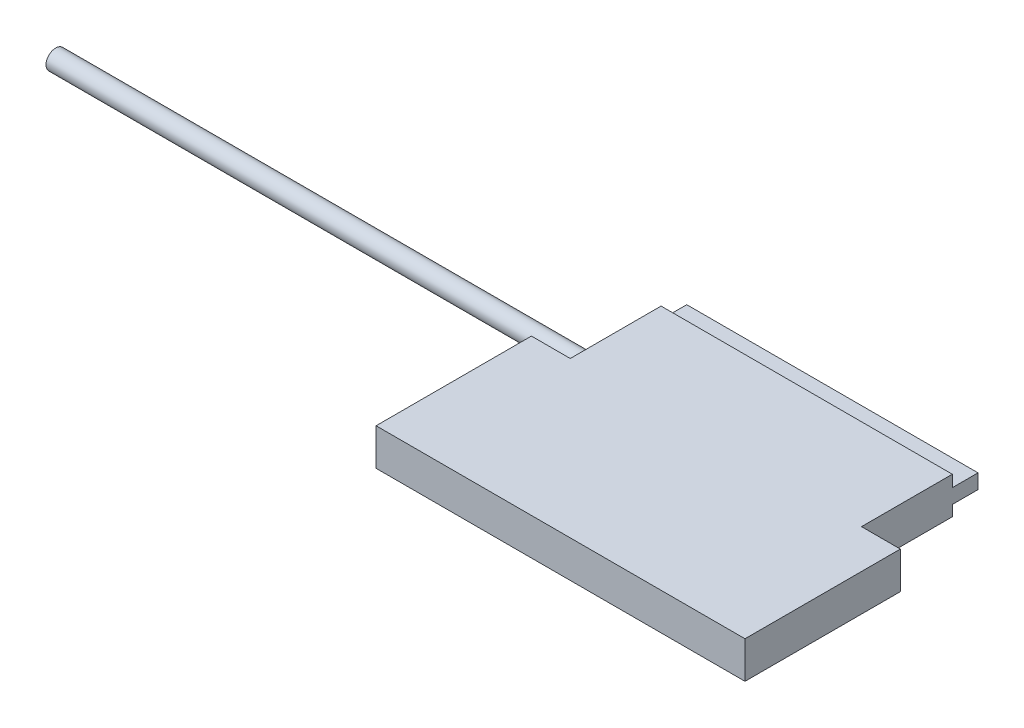
ISO-10303-21;
HEADER;
FILE_DESCRIPTION(('STEP AP214'),'2;1');
FILE_NAME('part.step','',(''),(''),'','','');
FILE_SCHEMA(('AUTOMOTIVE_DESIGN { 1 0 10303 214 1 1 1 1 }'));
ENDSEC;
DATA;
#1=APPLICATION_CONTEXT('core data for automotive mechanical design processes');
#2=APPLICATION_PROTOCOL_DEFINITION('international standard','automotive_design',2000,#1);
#3=PRODUCT_CONTEXT('',#1,'mechanical');
#4=PRODUCT('Part','Part','',(#3));
#5=PRODUCT_RELATED_PRODUCT_CATEGORY('part','',(#4));
#6=PRODUCT_DEFINITION_FORMATION('','',#4);
#7=PRODUCT_DEFINITION_CONTEXT('part definition',#1,'design');
#8=PRODUCT_DEFINITION('design','',#6,#7);
#9=PRODUCT_DEFINITION_SHAPE('','',#8);
#10=(LENGTH_UNIT() NAMED_UNIT(*) SI_UNIT(.MILLI.,.METRE.));
#11=(NAMED_UNIT(*) PLANE_ANGLE_UNIT() SI_UNIT($,.RADIAN.));
#12=(NAMED_UNIT(*) SI_UNIT($,.STERADIAN.) SOLID_ANGLE_UNIT());
#13=UNCERTAINTY_MEASURE_WITH_UNIT(LENGTH_MEASURE(1.E-05),#10,'distance_accuracy_value','');
#14=(GEOMETRIC_REPRESENTATION_CONTEXT(3) GLOBAL_UNCERTAINTY_ASSIGNED_CONTEXT((#13)) GLOBAL_UNIT_ASSIGNED_CONTEXT((#10,
#11,#12)) REPRESENTATION_CONTEXT('',''));
#15=CARTESIAN_POINT('',(0.,0.,0.));
#16=DIRECTION('',(0.,0.,1.));
#17=DIRECTION('',(1.,0.,0.));
#18=AXIS2_PLACEMENT_3D('',#15,#16,#17);
#19=CARTESIAN_POINT('',(0.,1.9,-8.));
#20=DIRECTION('',(1.,0.,0.));
#21=DIRECTION('',(0.,0.,-1.));
#22=AXIS2_PLACEMENT_3D('',#19,#20,#21);
#23=PLANE('',#22);
#24=DIRECTION('',(0.,0.,1.));
#25=VECTOR('',#24,1.);
#26=CARTESIAN_POINT('',(0.,0.,-8.));
#27=LINE('',#26,#25);
#28=CARTESIAN_POINT('',(0.,0.,-8.));
#29=VERTEX_POINT('',#28);
#30=CARTESIAN_POINT('',(0.,0.,0.));
#31=VERTEX_POINT('',#30);
#32=EDGE_CURVE('E163',#29,#31,#27,.T.);
#33=ORIENTED_EDGE('',*,*,#32,.T.);
#34=DIRECTION('',(0.,-1.,0.));
#35=VECTOR('',#34,1.);
#36=CARTESIAN_POINT('',(0.,1.9,0.));
#37=LINE('',#36,#35);
#38=CARTESIAN_POINT('',(0.,1.9,0.));
#39=VERTEX_POINT('',#38);
#40=EDGE_CURVE('E216',#39,#31,#37,.T.);
#41=ORIENTED_EDGE('',*,*,#40,.F.);
#42=DIRECTION('',(0.,0.,1.));
#43=VECTOR('',#42,1.);
#44=CARTESIAN_POINT('',(0.,1.9,-8.));
#45=LINE('',#44,#43);
#46=CARTESIAN_POINT('',(0.,1.9,-8.));
#47=VERTEX_POINT('',#46);
#48=EDGE_CURVE('E166',#47,#39,#45,.T.);
#49=ORIENTED_EDGE('',*,*,#48,.F.);
#50=DIRECTION('',(0.,-1.,0.));
#51=VECTOR('',#50,1.);
#52=CARTESIAN_POINT('',(0.,1.9,-8.));
#53=LINE('',#52,#51);
#54=EDGE_CURVE('E182',#47,#29,#53,.T.);
#55=ORIENTED_EDGE('',*,*,#54,.T.);
#56=EDGE_LOOP('',(#33,#41,#49,#55));
#57=FACE_BOUND('',#56,.T.);
#58=ADVANCED_FACE('F33',(#57),#23,.F.);
#59=CARTESIAN_POINT('',(0.,1.9,0.));
#60=DIRECTION('',(0.,0.,-1.));
#61=DIRECTION('',(-1.,0.,0.));
#62=AXIS2_PLACEMENT_3D('',#59,#60,#61);
#63=PLANE('',#62);
#64=DIRECTION('',(1.,0.,0.));
#65=VECTOR('',#64,1.);
#66=CARTESIAN_POINT('',(0.,0.,0.));
#67=LINE('',#66,#65);
#68=CARTESIAN_POINT('',(19.,0.,0.));
#69=VERTEX_POINT('',#68);
#70=EDGE_CURVE('E185',#31,#69,#67,.T.);
#71=ORIENTED_EDGE('',*,*,#70,.T.);
#72=DIRECTION('',(0.,-1.,0.));
#73=VECTOR('',#72,1.);
#74=CARTESIAN_POINT('',(19.,1.9,0.));
#75=LINE('',#74,#73);
#76=CARTESIAN_POINT('',(19.,1.9,0.));
#77=VERTEX_POINT('',#76);
#78=EDGE_CURVE('E213',#77,#69,#75,.T.);
#79=ORIENTED_EDGE('',*,*,#78,.F.);
#80=DIRECTION('',(1.,0.,0.));
#81=VECTOR('',#80,1.);
#82=CARTESIAN_POINT('',(0.,1.9,0.));
#83=LINE('',#82,#81);
#84=EDGE_CURVE('E169',#39,#77,#83,.T.);
#85=ORIENTED_EDGE('',*,*,#84,.F.);
#86=ORIENTED_EDGE('',*,*,#40,.T.);
#87=EDGE_LOOP('',(#71,#79,#85,#86));
#88=FACE_BOUND('',#87,.T.);
#89=ADVANCED_FACE('F259',(#88),#63,.F.);
#90=CARTESIAN_POINT('',(19.,1.9,0.));
#91=DIRECTION('',(-1.,0.,0.));
#92=DIRECTION('',(0.,0.,1.));
#93=AXIS2_PLACEMENT_3D('',#90,#91,#92);
#94=PLANE('',#93);
#95=DIRECTION('',(0.,0.,-1.));
#96=VECTOR('',#95,1.);
#97=CARTESIAN_POINT('',(19.,0.,0.));
#98=LINE('',#97,#96);
#99=CARTESIAN_POINT('',(19.,0.,-8.));
#100=VERTEX_POINT('',#99);
#101=EDGE_CURVE('E187',#69,#100,#98,.T.);
#102=ORIENTED_EDGE('',*,*,#101,.T.);
#103=DIRECTION('',(0.,-1.,0.));
#104=VECTOR('',#103,1.);
#105=CARTESIAN_POINT('',(19.,1.9,-8.));
#106=LINE('',#105,#104);
#107=CARTESIAN_POINT('',(19.,1.9,-8.));
#108=VERTEX_POINT('',#107);
#109=EDGE_CURVE('E210',#108,#100,#106,.T.);
#110=ORIENTED_EDGE('',*,*,#109,.F.);
#111=DIRECTION('',(0.,0.,-1.));
#112=VECTOR('',#111,1.);
#113=CARTESIAN_POINT('',(19.,1.9,0.));
#114=LINE('',#113,#112);
#115=EDGE_CURVE('E172',#77,#108,#114,.T.);
#116=ORIENTED_EDGE('',*,*,#115,.F.);
#117=ORIENTED_EDGE('',*,*,#78,.T.);
#118=EDGE_LOOP('',(#102,#110,#116,#117));
#119=FACE_BOUND('',#118,.T.);
#120=ADVANCED_FACE('F264',(#119),#94,.F.);
#121=CARTESIAN_POINT('',(19.,1.9,-8.));
#122=DIRECTION('',(0.,0.,1.));
#123=DIRECTION('',(1.,0.,0.));
#124=AXIS2_PLACEMENT_3D('',#121,#122,#123);
#125=PLANE('',#124);
#126=DIRECTION('',(-1.,0.,0.));
#127=VECTOR('',#126,1.);
#128=CARTESIAN_POINT('',(19.,0.,-8.));
#129=LINE('',#128,#127);
#130=CARTESIAN_POINT('',(17.,0.,-8.));
#131=VERTEX_POINT('',#130);
#132=EDGE_CURVE('E189',#100,#131,#129,.T.);
#133=ORIENTED_EDGE('',*,*,#132,.T.);
#134=DIRECTION('',(0.,-1.,0.));
#135=VECTOR('',#134,1.);
#136=CARTESIAN_POINT('',(17.,1.9,-8.));
#137=LINE('',#136,#135);
#138=CARTESIAN_POINT('',(17.,1.9,-8.));
#139=VERTEX_POINT('',#138);
#140=EDGE_CURVE('E207',#139,#131,#137,.T.);
#141=ORIENTED_EDGE('',*,*,#140,.F.);
#142=DIRECTION('',(-1.,0.,0.));
#143=VECTOR('',#142,1.);
#144=CARTESIAN_POINT('',(19.,1.9,-8.));
#145=LINE('',#144,#143);
#146=EDGE_CURVE('E174',#108,#139,#145,.T.);
#147=ORIENTED_EDGE('',*,*,#146,.F.);
#148=ORIENTED_EDGE('',*,*,#109,.T.);
#149=EDGE_LOOP('',(#133,#141,#147,#148));
#150=FACE_BOUND('',#149,.T.);
#151=ADVANCED_FACE('F274',(#150),#125,.F.);
#152=CARTESIAN_POINT('',(17.,1.9,-8.));
#153=DIRECTION('',(-1.,0.,0.));
#154=DIRECTION('',(0.,0.,1.));
#155=AXIS2_PLACEMENT_3D('',#152,#153,#154);
#156=PLANE('',#155);
#157=DIRECTION('',(0.,0.,-1.));
#158=VECTOR('',#157,1.);
#159=CARTESIAN_POINT('',(17.,1.3,-12.6773306818481));
#160=LINE('',#159,#158);
#161=CARTESIAN_POINT('',(17.,1.3,-12.6773306818481));
#162=VERTEX_POINT('',#161);
#163=CARTESIAN_POINT('',(17.,1.3,-14.));
#164=VERTEX_POINT('',#163);
#165=EDGE_CURVE('E127',#162,#164,#160,.T.);
#166=ORIENTED_EDGE('',*,*,#165,.F.);
#167=DIRECTION('',(0.,-1.,0.));
#168=VECTOR('',#167,1.);
#169=CARTESIAN_POINT('',(17.,1.9,-12.6773306818481));
#170=LINE('',#169,#168);
#171=CARTESIAN_POINT('',(17.,1.9,-12.6773306818481));
#172=VERTEX_POINT('',#171);
#173=EDGE_CURVE('E132',#172,#162,#170,.T.);
#174=ORIENTED_EDGE('',*,*,#173,.F.);
#175=DIRECTION('',(0.,0.,-1.));
#176=VECTOR('',#175,1.);
#177=CARTESIAN_POINT('',(17.,1.9,-8.));
#178=LINE('',#177,#176);
#179=EDGE_CURVE('E176',#139,#172,#178,.T.);
#180=ORIENTED_EDGE('',*,*,#179,.F.);
#181=ORIENTED_EDGE('',*,*,#140,.T.);
#182=DIRECTION('',(0.,0.,-1.));
#183=VECTOR('',#182,1.);
#184=CARTESIAN_POINT('',(17.,0.,-8.));
#185=LINE('',#184,#183);
#186=CARTESIAN_POINT('',(17.,0.,-12.6773306818481));
#187=VERTEX_POINT('',#186);
#188=EDGE_CURVE('E191',#131,#187,#185,.T.);
#189=ORIENTED_EDGE('',*,*,#188,.T.);
#190=DIRECTION('',(0.,-1.,0.));
#191=VECTOR('',#190,1.);
#192=CARTESIAN_POINT('',(17.,0.,-12.6773306818481));
#193=LINE('',#192,#191);
#194=CARTESIAN_POINT('',(17.,0.55,-12.6773306818481));
#195=VERTEX_POINT('',#194);
#196=EDGE_CURVE('E55',#195,#187,#193,.T.);
#197=ORIENTED_EDGE('',*,*,#196,.F.);
#198=DIRECTION('',(0.,0.,1.));
#199=VECTOR('',#198,1.);
#200=CARTESIAN_POINT('',(17.,0.55,-12.6773306818481));
#201=LINE('',#200,#199);
#202=CARTESIAN_POINT('',(17.,0.55,-14.));
#203=VERTEX_POINT('',#202);
#204=EDGE_CURVE('E150',#203,#195,#201,.T.);
#205=ORIENTED_EDGE('',*,*,#204,.F.);
#206=DIRECTION('',(0.,-1.,0.));
#207=VECTOR('',#206,1.);
#208=CARTESIAN_POINT('',(17.,1.9,-14.));
#209=LINE('',#208,#207);
#210=EDGE_CURVE('E144',#164,#203,#209,.T.);
#211=ORIENTED_EDGE('',*,*,#210,.F.);
#212=EDGE_LOOP('',(#166,#174,#180,#181,#189,#197,#205,#211));
#213=FACE_BOUND('',#212,.T.);
#214=ADVANCED_FACE('F141',(#213),#156,.F.);
#215=CARTESIAN_POINT('',(17.,1.9,-14.));
#216=DIRECTION('',(0.,0.,1.));
#217=DIRECTION('',(1.,0.,0.));
#218=AXIS2_PLACEMENT_3D('',#215,#216,#217);
#219=PLANE('',#218);
#220=DIRECTION('',(0.,-1.,0.));
#221=VECTOR('',#220,1.);
#222=CARTESIAN_POINT('',(2.,1.9,-14.));
#223=LINE('',#222,#221);
#224=CARTESIAN_POINT('',(2.,1.3,-14.));
#225=VERTEX_POINT('',#224);
#226=CARTESIAN_POINT('',(2.,0.55,-14.));
#227=VERTEX_POINT('',#226);
#228=EDGE_CURVE('E203',#225,#227,#223,.T.);
#229=ORIENTED_EDGE('',*,*,#228,.F.);
#230=DIRECTION('',(1.,0.,0.));
#231=VECTOR('',#230,1.);
#232=CARTESIAN_POINT('',(1.,1.3,-14.));
#233=LINE('',#232,#231);
#234=EDGE_CURVE('E129',#225,#164,#233,.T.);
#235=ORIENTED_EDGE('',*,*,#234,.T.);
#236=ORIENTED_EDGE('',*,*,#210,.T.);
#237=DIRECTION('',(1.,0.,0.));
#238=VECTOR('',#237,1.);
#239=CARTESIAN_POINT('',(1.,0.55,-14.));
#240=LINE('',#239,#238);
#241=EDGE_CURVE('E153',#227,#203,#240,.T.);
#242=ORIENTED_EDGE('',*,*,#241,.F.);
#243=EDGE_LOOP('',(#229,#235,#236,#242));
#244=FACE_BOUND('',#243,.T.);
#245=ADVANCED_FACE('F232',(#244),#219,.F.);
#246=CARTESIAN_POINT('',(2.,1.9,-14.));
#247=DIRECTION('',(1.,0.,0.));
#248=DIRECTION('',(0.,0.,-1.));
#249=AXIS2_PLACEMENT_3D('',#246,#247,#248);
#250=PLANE('',#249);
#251=DIRECTION('',(0.,0.,1.));
#252=VECTOR('',#251,1.);
#253=CARTESIAN_POINT('',(2.,1.9,-14.));
#254=LINE('',#253,#252);
#255=CARTESIAN_POINT('',(2.,1.9,-12.6773306818481));
#256=VERTEX_POINT('',#255);
#257=CARTESIAN_POINT('',(2.,1.9,-8.));
#258=VERTEX_POINT('',#257);
#259=EDGE_CURVE('E178',#256,#258,#254,.T.);
#260=ORIENTED_EDGE('',*,*,#259,.F.);
#261=DIRECTION('',(0.,-1.,0.));
#262=VECTOR('',#261,1.);
#263=CARTESIAN_POINT('',(2.,1.9,-12.6773306818481));
#264=LINE('',#263,#262);
#265=CARTESIAN_POINT('',(2.,1.3,-12.6773306818481));
#266=VERTEX_POINT('',#265);
#267=EDGE_CURVE('E47',#256,#266,#264,.T.);
#268=ORIENTED_EDGE('',*,*,#267,.T.);
#269=DIRECTION('',(0.,0.,-1.));
#270=VECTOR('',#269,1.);
#271=CARTESIAN_POINT('',(2.,1.3,-14.));
#272=LINE('',#271,#270);
#273=EDGE_CURVE('E11',#266,#225,#272,.T.);
#274=ORIENTED_EDGE('',*,*,#273,.T.);
#275=ORIENTED_EDGE('',*,*,#228,.T.);
#276=DIRECTION('',(0.,0.,1.));
#277=VECTOR('',#276,1.);
#278=CARTESIAN_POINT('',(2.,0.55,-14.));
#279=LINE('',#278,#277);
#280=CARTESIAN_POINT('',(2.,0.55,-12.6773306818481));
#281=VERTEX_POINT('',#280);
#282=EDGE_CURVE('E40',#227,#281,#279,.T.);
#283=ORIENTED_EDGE('',*,*,#282,.T.);
#284=DIRECTION('',(0.,-1.,0.));
#285=VECTOR('',#284,1.);
#286=CARTESIAN_POINT('',(2.,1.9,-12.6773306818481));
#287=LINE('',#286,#285);
#288=CARTESIAN_POINT('',(2.,0.,-12.6773306818481));
#289=VERTEX_POINT('',#288);
#290=EDGE_CURVE('E147',#281,#289,#287,.T.);
#291=ORIENTED_EDGE('',*,*,#290,.T.);
#292=DIRECTION('',(0.,0.,1.));
#293=VECTOR('',#292,1.);
#294=CARTESIAN_POINT('',(2.,0.,-14.));
#295=LINE('',#294,#293);
#296=CARTESIAN_POINT('',(2.,0.,-9.5));
#297=VERTEX_POINT('',#296);
#298=EDGE_CURVE('E195',#289,#297,#295,.T.);
#299=ORIENTED_EDGE('',*,*,#298,.T.);
#300=CARTESIAN_POINT('',(2.,0.5,-9.5));
#301=DIRECTION('',(-1.,0.,0.));
#302=DIRECTION('',(0.,0.,1.));
#303=AXIS2_PLACEMENT_3D('',#300,#301,#302);
#304=CIRCLE('',#303,0.500000000000001);
#305=EDGE_CURVE('E159',#297,#297,#304,.T.);
#306=ORIENTED_EDGE('',*,*,#305,.F.);
#307=CARTESIAN_POINT('',(2.,0.,-8.));
#308=VERTEX_POINT('',#307);
#309=EDGE_CURVE('E194',#297,#308,#295,.T.);
#310=ORIENTED_EDGE('',*,*,#309,.T.);
#311=DIRECTION('',(0.,-1.,0.));
#312=VECTOR('',#311,1.);
#313=CARTESIAN_POINT('',(2.,1.9,-8.));
#314=LINE('',#313,#312);
#315=EDGE_CURVE('E200',#258,#308,#314,.T.);
#316=ORIENTED_EDGE('',*,*,#315,.F.);
#317=EDGE_LOOP('',(#260,#268,#274,#275,#283,#291,#299,#306,#310,#316));
#318=FACE_BOUND('',#317,.T.);
#319=ADVANCED_FACE('F224',(#318),#250,.F.);
#320=CARTESIAN_POINT('',(2.,1.9,-8.));
#321=DIRECTION('',(0.,0.,1.));
#322=DIRECTION('',(1.,0.,0.));
#323=AXIS2_PLACEMENT_3D('',#320,#321,#322);
#324=PLANE('',#323);
#325=DIRECTION('',(-1.,0.,0.));
#326=VECTOR('',#325,1.);
#327=CARTESIAN_POINT('',(2.,0.,-8.));
#328=LINE('',#327,#326);
#329=EDGE_CURVE('E170',#308,#29,#328,.T.);
#330=ORIENTED_EDGE('',*,*,#329,.T.);
#331=ORIENTED_EDGE('',*,*,#54,.F.);
#332=DIRECTION('',(-1.,0.,0.));
#333=VECTOR('',#332,1.);
#334=CARTESIAN_POINT('',(2.,1.9,-8.));
#335=LINE('',#334,#333);
#336=EDGE_CURVE('E180',#258,#47,#335,.T.);
#337=ORIENTED_EDGE('',*,*,#336,.F.);
#338=ORIENTED_EDGE('',*,*,#315,.T.);
#339=EDGE_LOOP('',(#330,#331,#337,#338));
#340=FACE_BOUND('',#339,.T.);
#341=ADVANCED_FACE('F289',(#340),#324,.F.);
#342=CARTESIAN_POINT('',(0.,1.9,0.));
#343=DIRECTION('',(0.,1.,0.));
#344=DIRECTION('',(0.,0.,1.));
#345=AXIS2_PLACEMENT_3D('',#342,#343,#344);
#346=PLANE('',#345);
#347=DIRECTION('',(1.,0.,0.));
#348=VECTOR('',#347,1.);
#349=CARTESIAN_POINT('',(0.,1.9,-12.6773306818481));
#350=LINE('',#349,#348);
#351=EDGE_CURVE('E134',#256,#172,#350,.T.);
#352=ORIENTED_EDGE('',*,*,#351,.F.);
#353=ORIENTED_EDGE('',*,*,#259,.T.);
#354=ORIENTED_EDGE('',*,*,#336,.T.);
#355=ORIENTED_EDGE('',*,*,#48,.T.);
#356=ORIENTED_EDGE('',*,*,#84,.T.);
#357=ORIENTED_EDGE('',*,*,#115,.T.);
#358=ORIENTED_EDGE('',*,*,#146,.T.);
#359=ORIENTED_EDGE('',*,*,#179,.T.);
#360=EDGE_LOOP('',(#352,#353,#354,#355,#356,#357,#358,#359));
#361=FACE_BOUND('',#360,.T.);
#362=ADVANCED_FACE('F236',(#361),#346,.T.);
#363=CARTESIAN_POINT('',(0.,0.,0.));
#364=DIRECTION('',(0.,1.,0.));
#365=DIRECTION('',(0.,0.,1.));
#366=AXIS2_PLACEMENT_3D('',#363,#364,#365);
#367=PLANE('',#366);
#368=ORIENTED_EDGE('',*,*,#298,.F.);
#369=DIRECTION('',(1.,0.,0.));
#370=VECTOR('',#369,1.);
#371=CARTESIAN_POINT('',(0.,0.,-12.6773306818481));
#372=LINE('',#371,#370);
#373=EDGE_CURVE('E219',#289,#187,#372,.T.);
#374=ORIENTED_EDGE('',*,*,#373,.T.);
#375=ORIENTED_EDGE('',*,*,#188,.F.);
#376=ORIENTED_EDGE('',*,*,#132,.F.);
#377=ORIENTED_EDGE('',*,*,#101,.F.);
#378=ORIENTED_EDGE('',*,*,#70,.F.);
#379=ORIENTED_EDGE('',*,*,#32,.F.);
#380=ORIENTED_EDGE('',*,*,#329,.F.);
#381=ORIENTED_EDGE('',*,*,#309,.F.);
#382=EDGE_LOOP('',(#368,#374,#375,#376,#377,#378,#379,#380,#381));
#383=FACE_BOUND('',#382,.T.);
#384=ADVANCED_FACE('F244',(#383),#367,.F.);
#385=CARTESIAN_POINT('',(-26.,0.5,-9.49999999999999));
#386=DIRECTION('',(1.,0.,0.));
#387=DIRECTION('',(0.,0.,-1.));
#388=AXIS2_PLACEMENT_3D('',#385,#386,#387);
#389=CYLINDRICAL_SURFACE('',#388,0.500000000000001);
#390=CARTESIAN_POINT('',(-26.,0.5,-9.49999999999999));
#391=DIRECTION('',(-1.,0.,0.));
#392=DIRECTION('',(0.,0.,1.));
#393=AXIS2_PLACEMENT_3D('',#390,#391,#392);
#394=CIRCLE('',#393,0.500000000000001);
#395=CARTESIAN_POINT('',(-26.,0.5,-8.99999999999999));
#396=VERTEX_POINT('',#395);
#397=EDGE_CURVE('E160',#396,#396,#394,.T.);
#398=ORIENTED_EDGE('',*,*,#397,.F.);
#399=EDGE_LOOP('',(#398));
#400=FACE_BOUND('',#399,.T.);
#401=ORIENTED_EDGE('',*,*,#305,.T.);
#402=EDGE_LOOP('',(#401));
#403=FACE_BOUND('',#402,.T.);
#404=ADVANCED_FACE('F295',(#400,#403),#389,.T.);
#405=CARTESIAN_POINT('',(-26.,0.5,-9.49999999999999));
#406=DIRECTION('',(-1.,0.,0.));
#407=DIRECTION('',(0.,0.,1.));
#408=AXIS2_PLACEMENT_3D('',#405,#406,#407);
#409=PLANE('',#408);
#410=ORIENTED_EDGE('',*,*,#397,.T.);
#411=EDGE_LOOP('',(#410));
#412=FACE_BOUND('',#411,.T.);
#413=ADVANCED_FACE('F255',(#412),#409,.T.);
#414=CARTESIAN_POINT('',(1.,0.55,-12.6773306818481));
#415=DIRECTION('',(0.,1.,0.));
#416=DIRECTION('',(0.,0.,1.));
#417=AXIS2_PLACEMENT_3D('',#414,#415,#416);
#418=PLANE('',#417);
#419=ORIENTED_EDGE('',*,*,#241,.T.);
#420=ORIENTED_EDGE('',*,*,#204,.T.);
#421=DIRECTION('',(1.,0.,0.));
#422=VECTOR('',#421,1.);
#423=CARTESIAN_POINT('',(1.,0.55,-12.6773306818481));
#424=LINE('',#423,#422);
#425=EDGE_CURVE('E138',#281,#195,#424,.T.);
#426=ORIENTED_EDGE('',*,*,#425,.F.);
#427=ORIENTED_EDGE('',*,*,#282,.F.);
#428=EDGE_LOOP('',(#419,#420,#426,#427));
#429=FACE_BOUND('',#428,.T.);
#430=ADVANCED_FACE('F230',(#429),#418,.F.);
#431=CARTESIAN_POINT('',(1.,0.,-12.6773306818481));
#432=DIRECTION('',(0.,0.,1.));
#433=DIRECTION('',(1.,0.,0.));
#434=AXIS2_PLACEMENT_3D('',#431,#432,#433);
#435=PLANE('',#434);
#436=ORIENTED_EDGE('',*,*,#425,.T.);
#437=ORIENTED_EDGE('',*,*,#196,.T.);
#438=ORIENTED_EDGE('',*,*,#373,.F.);
#439=ORIENTED_EDGE('',*,*,#290,.F.);
#440=EDGE_LOOP('',(#436,#437,#438,#439));
#441=FACE_BOUND('',#440,.T.);
#442=ADVANCED_FACE('F247',(#441),#435,.F.);
#443=CARTESIAN_POINT('',(1.,1.3,-12.6773306818481));
#444=DIRECTION('',(0.,-1.,0.));
#445=DIRECTION('',(0.,0.,-1.));
#446=AXIS2_PLACEMENT_3D('',#443,#444,#445);
#447=PLANE('',#446);
#448=DIRECTION('',(1.,0.,0.));
#449=VECTOR('',#448,1.);
#450=CARTESIAN_POINT('',(1.,1.3,-12.6773306818481));
#451=LINE('',#450,#449);
#452=EDGE_CURVE('E123',#266,#162,#451,.T.);
#453=ORIENTED_EDGE('',*,*,#452,.T.);
#454=ORIENTED_EDGE('',*,*,#165,.T.);
#455=ORIENTED_EDGE('',*,*,#234,.F.);
#456=ORIENTED_EDGE('',*,*,#273,.F.);
#457=EDGE_LOOP('',(#453,#454,#455,#456));
#458=FACE_BOUND('',#457,.T.);
#459=ADVANCED_FACE('F125',(#458),#447,.F.);
#460=CARTESIAN_POINT('',(1.,1.9,-12.6773306818481));
#461=DIRECTION('',(0.,0.,1.));
#462=DIRECTION('',(1.,0.,0.));
#463=AXIS2_PLACEMENT_3D('',#460,#461,#462);
#464=PLANE('',#463);
#465=ORIENTED_EDGE('',*,*,#351,.T.);
#466=ORIENTED_EDGE('',*,*,#173,.T.);
#467=ORIENTED_EDGE('',*,*,#452,.F.);
#468=ORIENTED_EDGE('',*,*,#267,.F.);
#469=EDGE_LOOP('',(#465,#466,#467,#468));
#470=FACE_BOUND('',#469,.T.);
#471=ADVANCED_FACE('F133',(#470),#464,.F.);
#472=CLOSED_SHELL('',(#58,#89,#120,#151,#214,#245,#319,#341,#362,#384,#404,#413,#430,#442,#459,#471));
#473=MANIFOLD_SOLID_BREP('B2',#472);
#474=ADVANCED_BREP_SHAPE_REPRESENTATION('',(#18,#473),#14);
#475=SHAPE_DEFINITION_REPRESENTATION(#9,#474);
ENDSEC;
END-ISO-10303-21;
